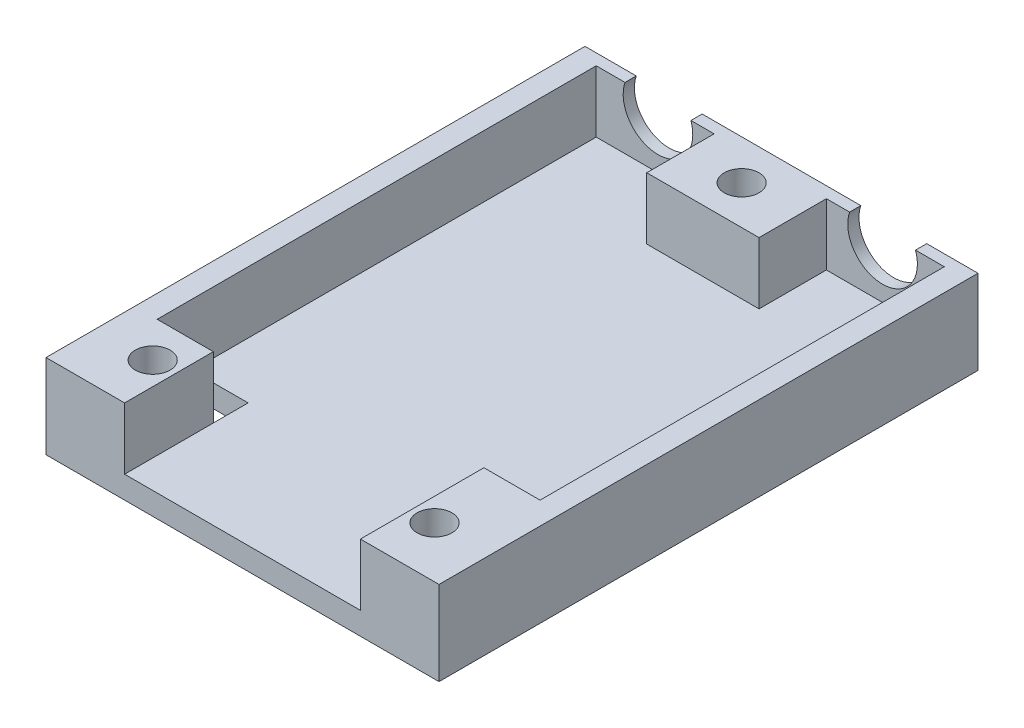
ISO-10303-21;
HEADER;
FILE_DESCRIPTION(('STEP AP214'),'2;1');
FILE_NAME('part.step','',(''),(''),'','','');
FILE_SCHEMA(('AUTOMOTIVE_DESIGN { 1 0 10303 214 1 1 1 1 }'));
ENDSEC;
DATA;
#1=APPLICATION_CONTEXT('core data for automotive mechanical design processes');
#2=APPLICATION_PROTOCOL_DEFINITION('international standard','automotive_design',2000,#1);
#3=PRODUCT_CONTEXT('',#1,'mechanical');
#4=PRODUCT('Part','Part','',(#3));
#5=PRODUCT_RELATED_PRODUCT_CATEGORY('part','',(#4));
#6=PRODUCT_DEFINITION_FORMATION('','',#4);
#7=PRODUCT_DEFINITION_CONTEXT('part definition',#1,'design');
#8=PRODUCT_DEFINITION('design','',#6,#7);
#9=PRODUCT_DEFINITION_SHAPE('','',#8);
#10=(LENGTH_UNIT() NAMED_UNIT(*) SI_UNIT(.MILLI.,.METRE.));
#11=(NAMED_UNIT(*) PLANE_ANGLE_UNIT() SI_UNIT($,.RADIAN.));
#12=(NAMED_UNIT(*) SI_UNIT($,.STERADIAN.) SOLID_ANGLE_UNIT());
#13=UNCERTAINTY_MEASURE_WITH_UNIT(LENGTH_MEASURE(1.E-05),#10,'distance_accuracy_value','');
#14=(GEOMETRIC_REPRESENTATION_CONTEXT(3) GLOBAL_UNCERTAINTY_ASSIGNED_CONTEXT((#13)) GLOBAL_UNIT_ASSIGNED_CONTEXT((#10,
#11,#12)) REPRESENTATION_CONTEXT('',''));
#15=CARTESIAN_POINT('',(0.,0.,0.));
#16=DIRECTION('',(0.,0.,1.));
#17=DIRECTION('',(1.,0.,0.));
#18=AXIS2_PLACEMENT_3D('',#15,#16,#17);
#19=CARTESIAN_POINT('',(0.,7.5,-23.));
#20=DIRECTION('',(0.,0.,-1.));
#21=DIRECTION('',(-1.,0.,0.));
#22=AXIS2_PLACEMENT_3D('',#19,#20,#21);
#23=PLANE('',#22);
#24=CARTESIAN_POINT('',(-10.,6.5,-23.));
#25=DIRECTION('',(0.,0.,-1.));
#26=DIRECTION('',(-1.,0.,0.));
#27=AXIS2_PLACEMENT_3D('',#24,#25,#26);
#28=CIRCLE('',#27,3.1);
#29=CARTESIAN_POINT('',(-12.9342801502242,7.5,-23.));
#30=VERTEX_POINT('',#29);
#31=CARTESIAN_POINT('',(-7.06571984977576,7.5,-23.));
#32=VERTEX_POINT('',#31);
#33=EDGE_CURVE('E299',#30,#32,#28,.F.);
#34=ORIENTED_EDGE('',*,*,#33,.F.);
#35=DIRECTION('',(1.,0.,0.));
#36=VECTOR('',#35,1.);
#37=CARTESIAN_POINT('',(0.,7.5,-23.));
#38=LINE('',#37,#36);
#39=CARTESIAN_POINT('',(-15.5,7.5,-23.));
#40=VERTEX_POINT('',#39);
#41=EDGE_CURVE('E494',#40,#30,#38,.T.);
#42=ORIENTED_EDGE('',*,*,#41,.F.);
#43=DIRECTION('',(0.,-1.,0.));
#44=VECTOR('',#43,1.);
#45=CARTESIAN_POINT('',(-15.5,7.5,-23.));
#46=LINE('',#45,#44);
#47=CARTESIAN_POINT('',(-15.5,2.,-23.));
#48=VERTEX_POINT('',#47);
#49=EDGE_CURVE('E249',#40,#48,#46,.T.);
#50=ORIENTED_EDGE('',*,*,#49,.T.);
#51=DIRECTION('',(1.,0.,0.));
#52=VECTOR('',#51,1.);
#53=CARTESIAN_POINT('',(0.,2.,-23.));
#54=LINE('',#53,#52);
#55=CARTESIAN_POINT('',(-4.99999999999998,2.,-23.));
#56=VERTEX_POINT('',#55);
#57=EDGE_CURVE('E502',#48,#56,#54,.T.);
#58=ORIENTED_EDGE('',*,*,#57,.T.);
#59=DIRECTION('',(0.,-1.,0.));
#60=VECTOR('',#59,1.);
#61=CARTESIAN_POINT('',(-4.99999999999998,7.5,-23.));
#62=LINE('',#61,#60);
#63=CARTESIAN_POINT('',(-4.99999999999998,7.5,-23.));
#64=VERTEX_POINT('',#63);
#65=EDGE_CURVE('E452',#64,#56,#62,.T.);
#66=ORIENTED_EDGE('',*,*,#65,.F.);
#67=EDGE_CURVE('E497',#32,#64,#38,.T.);
#68=ORIENTED_EDGE('',*,*,#67,.F.);
#69=EDGE_LOOP('',(#34,#42,#50,#58,#66,#68));
#70=FACE_BOUND('',#69,.T.);
#71=ADVANCED_FACE('F41',(#70),#23,.F.);
#72=CARTESIAN_POINT('',(10.,6.5,-23.));
#73=DIRECTION('',(0.,0.,-1.));
#74=DIRECTION('',(-1.,0.,0.));
#75=AXIS2_PLACEMENT_3D('',#72,#73,#74);
#76=CIRCLE('',#75,3.1);
#77=CARTESIAN_POINT('',(7.06571984977576,7.5,-23.));
#78=VERTEX_POINT('',#77);
#79=CARTESIAN_POINT('',(12.9342801502242,7.5,-23.));
#80=VERTEX_POINT('',#79);
#81=EDGE_CURVE('E304',#78,#80,#76,.F.);
#82=ORIENTED_EDGE('',*,*,#81,.F.);
#83=CARTESIAN_POINT('',(5.00000000000002,7.5,-23.));
#84=VERTEX_POINT('',#83);
#85=EDGE_CURVE('E498',#84,#78,#38,.T.);
#86=ORIENTED_EDGE('',*,*,#85,.F.);
#87=DIRECTION('',(0.,-1.,0.));
#88=VECTOR('',#87,1.);
#89=CARTESIAN_POINT('',(5.00000000000002,7.5,-23.));
#90=LINE('',#89,#88);
#91=CARTESIAN_POINT('',(5.00000000000002,2.,-23.));
#92=VERTEX_POINT('',#91);
#93=EDGE_CURVE('E464',#84,#92,#90,.T.);
#94=ORIENTED_EDGE('',*,*,#93,.T.);
#95=CARTESIAN_POINT('',(15.5,2.,-23.));
#96=VERTEX_POINT('',#95);
#97=EDGE_CURVE('E474',#92,#96,#54,.T.);
#98=ORIENTED_EDGE('',*,*,#97,.T.);
#99=DIRECTION('',(0.,-1.,0.));
#100=VECTOR('',#99,1.);
#101=CARTESIAN_POINT('',(15.5,7.5,-23.));
#102=LINE('',#101,#100);
#103=CARTESIAN_POINT('',(15.5,7.5,-23.));
#104=VERTEX_POINT('',#103);
#105=EDGE_CURVE('E516',#104,#96,#102,.T.);
#106=ORIENTED_EDGE('',*,*,#105,.F.);
#107=EDGE_CURVE('E493',#80,#104,#38,.T.);
#108=ORIENTED_EDGE('',*,*,#107,.F.);
#109=EDGE_LOOP('',(#82,#86,#94,#98,#106,#108));
#110=FACE_BOUND('',#109,.T.);
#111=ADVANCED_FACE('F597',(#110),#23,.F.);
#112=CARTESIAN_POINT('',(-17.5,2.,-24.));
#113=DIRECTION('',(0.,0.,1.));
#114=DIRECTION('',(1.,0.,0.));
#115=AXIS2_PLACEMENT_3D('',#112,#113,#114);
#116=PLANE('',#115);
#117=CARTESIAN_POINT('',(10.,6.5,-24.));
#118=DIRECTION('',(0.,0.,-1.));
#119=DIRECTION('',(-1.,0.,0.));
#120=AXIS2_PLACEMENT_3D('',#117,#118,#119);
#121=CIRCLE('',#120,3.1);
#122=CARTESIAN_POINT('',(7.06571984977576,7.5,-24.));
#123=VERTEX_POINT('',#122);
#124=CARTESIAN_POINT('',(12.9342801502242,7.5,-24.));
#125=VERTEX_POINT('',#124);
#126=EDGE_CURVE('E295',#123,#125,#121,.F.);
#127=ORIENTED_EDGE('',*,*,#126,.T.);
#128=DIRECTION('',(-1.,0.,0.));
#129=VECTOR('',#128,1.);
#130=CARTESIAN_POINT('',(0.,7.5,-24.));
#131=LINE('',#130,#129);
#132=CARTESIAN_POINT('',(17.5,7.5,-24.));
#133=VERTEX_POINT('',#132);
#134=EDGE_CURVE('E475',#133,#125,#131,.T.);
#135=ORIENTED_EDGE('',*,*,#134,.F.);
#136=DIRECTION('',(0.,-1.,0.));
#137=VECTOR('',#136,1.);
#138=CARTESIAN_POINT('',(17.5,2.,-24.));
#139=LINE('',#138,#137);
#140=CARTESIAN_POINT('',(17.5,0.,-24.));
#141=VERTEX_POINT('',#140);
#142=EDGE_CURVE('E537',#133,#141,#139,.T.);
#143=ORIENTED_EDGE('',*,*,#142,.T.);
#144=DIRECTION('',(-1.,0.,0.));
#145=VECTOR('',#144,1.);
#146=CARTESIAN_POINT('',(-17.5,0.,-24.));
#147=LINE('',#146,#145);
#148=CARTESIAN_POINT('',(-17.5,0.,-24.));
#149=VERTEX_POINT('',#148);
#150=EDGE_CURVE('E530',#141,#149,#147,.T.);
#151=ORIENTED_EDGE('',*,*,#150,.T.);
#152=DIRECTION('',(0.,-1.,0.));
#153=VECTOR('',#152,1.);
#154=CARTESIAN_POINT('',(-17.5,2.,-24.));
#155=LINE('',#154,#153);
#156=CARTESIAN_POINT('',(-17.5,7.5,-24.));
#157=VERTEX_POINT('',#156);
#158=EDGE_CURVE('E533',#157,#149,#155,.T.);
#159=ORIENTED_EDGE('',*,*,#158,.F.);
#160=CARTESIAN_POINT('',(-12.9342801502242,7.5,-24.));
#161=VERTEX_POINT('',#160);
#162=EDGE_CURVE('E481',#161,#157,#131,.T.);
#163=ORIENTED_EDGE('',*,*,#162,.F.);
#164=CARTESIAN_POINT('',(-10.,6.5,-24.));
#165=DIRECTION('',(0.,0.,-1.));
#166=DIRECTION('',(-1.,0.,0.));
#167=AXIS2_PLACEMENT_3D('',#164,#165,#166);
#168=CIRCLE('',#167,3.1);
#169=CARTESIAN_POINT('',(-7.06571984977576,7.5,-24.));
#170=VERTEX_POINT('',#169);
#171=EDGE_CURVE('E65',#161,#170,#168,.F.);
#172=ORIENTED_EDGE('',*,*,#171,.T.);
#173=EDGE_CURVE('E480',#123,#170,#131,.T.);
#174=ORIENTED_EDGE('',*,*,#173,.F.);
#175=EDGE_LOOP('',(#127,#135,#143,#151,#159,#163,#172,#174));
#176=FACE_BOUND('',#175,.T.);
#177=ADVANCED_FACE('F566',(#176),#116,.F.);
#178=CARTESIAN_POINT('',(0.,7.5,0.));
#179=DIRECTION('',(0.,1.,0.));
#180=DIRECTION('',(0.,0.,1.));
#181=AXIS2_PLACEMENT_3D('',#178,#179,#180);
#182=PLANE('',#181);
#183=CARTESIAN_POINT('',(12.55,7.5,19.45));
#184=DIRECTION('',(0.,1.,0.));
#185=DIRECTION('',(0.,0.,1.));
#186=AXIS2_PLACEMENT_3D('',#183,#184,#185);
#187=CIRCLE('',#186,1.55);
#188=CARTESIAN_POINT('',(12.55,7.5,21.));
#189=VERTEX_POINT('',#188);
#190=EDGE_CURVE('E946',#189,#189,#187,.T.);
#191=ORIENTED_EDGE('',*,*,#190,.F.);
#192=EDGE_LOOP('',(#191));
#193=FACE_BOUND('',#192,.T.);
#194=ORIENTED_EDGE('',*,*,#134,.T.);
#195=DIRECTION('',(0.,0.,-1.));
#196=VECTOR('',#195,1.);
#197=CARTESIAN_POINT('',(12.9342801502242,7.5,-22.));
#198=LINE('',#197,#196);
#199=EDGE_CURVE('E11',#125,#80,#198,.F.);
#200=ORIENTED_EDGE('',*,*,#199,.T.);
#201=ORIENTED_EDGE('',*,*,#107,.T.);
#202=DIRECTION('',(0.,0.,1.));
#203=VECTOR('',#202,1.);
#204=CARTESIAN_POINT('',(15.5,7.5,0.));
#205=LINE('',#204,#203);
#206=CARTESIAN_POINT('',(15.5,7.5,13.));
#207=VERTEX_POINT('',#206);
#208=EDGE_CURVE('E255',#104,#207,#205,.T.);
#209=ORIENTED_EDGE('',*,*,#208,.T.);
#210=DIRECTION('',(-1.,0.,0.));
#211=VECTOR('',#210,1.);
#212=CARTESIAN_POINT('',(15.5,7.5,13.));
#213=LINE('',#212,#211);
#214=CARTESIAN_POINT('',(10.5,7.5,13.));
#215=VERTEX_POINT('',#214);
#216=EDGE_CURVE('E410',#207,#215,#213,.T.);
#217=ORIENTED_EDGE('',*,*,#216,.T.);
#218=DIRECTION('',(0.,0.,1.));
#219=VECTOR('',#218,1.);
#220=CARTESIAN_POINT('',(10.5,7.5,21.));
#221=LINE('',#220,#219);
#222=CARTESIAN_POINT('',(10.5,7.5,24.));
#223=VERTEX_POINT('',#222);
#224=EDGE_CURVE('E413',#215,#223,#221,.T.);
#225=ORIENTED_EDGE('',*,*,#224,.T.);
#226=DIRECTION('',(1.,0.,0.));
#227=VECTOR('',#226,1.);
#228=CARTESIAN_POINT('',(0.,7.5,24.));
#229=LINE('',#228,#227);
#230=CARTESIAN_POINT('',(17.5,7.5,24.));
#231=VERTEX_POINT('',#230);
#232=EDGE_CURVE('E485',#223,#231,#229,.T.);
#233=ORIENTED_EDGE('',*,*,#232,.T.);
#234=DIRECTION('',(0.,0.,-1.));
#235=VECTOR('',#234,1.);
#236=CARTESIAN_POINT('',(17.5,7.5,0.));
#237=LINE('',#236,#235);
#238=EDGE_CURVE('E489',#231,#133,#237,.T.);
#239=ORIENTED_EDGE('',*,*,#238,.T.);
#240=EDGE_LOOP('',(#194,#200,#201,#209,#217,#225,#233,#239));
#241=FACE_BOUND('',#240,.T.);
#242=ADVANCED_FACE('F608',(#193,#241),#182,.T.);
#243=CARTESIAN_POINT('',(0.,7.5,-20.45));
#244=DIRECTION('',(0.,1.,0.));
#245=DIRECTION('',(0.,0.,1.));
#246=AXIS2_PLACEMENT_3D('',#243,#244,#245);
#247=CIRCLE('',#246,1.55);
#248=CARTESIAN_POINT('',(0.,7.5,-18.9));
#249=VERTEX_POINT('',#248);
#250=EDGE_CURVE('E959',#249,#249,#247,.T.);
#251=ORIENTED_EDGE('',*,*,#250,.F.);
#252=EDGE_LOOP('',(#251));
#253=FACE_BOUND('',#252,.T.);
#254=ORIENTED_EDGE('',*,*,#85,.T.);
#255=DIRECTION('',(0.,0.,-1.));
#256=VECTOR('',#255,1.);
#257=CARTESIAN_POINT('',(7.06571984977576,7.5,-22.));
#258=LINE('',#257,#256);
#259=EDGE_CURVE('E50',#78,#123,#258,.T.);
#260=ORIENTED_EDGE('',*,*,#259,.T.);
#261=ORIENTED_EDGE('',*,*,#173,.T.);
#262=DIRECTION('',(0.,0.,-1.));
#263=VECTOR('',#262,1.);
#264=CARTESIAN_POINT('',(-7.06571984977576,7.5,-22.));
#265=LINE('',#264,#263);
#266=EDGE_CURVE('E552',#170,#32,#265,.F.);
#267=ORIENTED_EDGE('',*,*,#266,.T.);
#268=ORIENTED_EDGE('',*,*,#67,.T.);
#269=DIRECTION('',(0.,0.,1.));
#270=VECTOR('',#269,1.);
#271=CARTESIAN_POINT('',(-4.99999999999998,7.5,-23.));
#272=LINE('',#271,#270);
#273=CARTESIAN_POINT('',(-4.99999999999998,7.5,-17.));
#274=VERTEX_POINT('',#273);
#275=EDGE_CURVE('E441',#64,#274,#272,.T.);
#276=ORIENTED_EDGE('',*,*,#275,.T.);
#277=DIRECTION('',(1.,0.,0.));
#278=VECTOR('',#277,1.);
#279=CARTESIAN_POINT('',(-4.99999999999998,7.5,-17.));
#280=LINE('',#279,#278);
#281=CARTESIAN_POINT('',(5.00000000000002,7.5,-17.));
#282=VERTEX_POINT('',#281);
#283=EDGE_CURVE('E445',#274,#282,#280,.T.);
#284=ORIENTED_EDGE('',*,*,#283,.T.);
#285=DIRECTION('',(0.,0.,-1.));
#286=VECTOR('',#285,1.);
#287=CARTESIAN_POINT('',(5.00000000000002,7.5,-23.));
#288=LINE('',#287,#286);
#289=EDGE_CURVE('E449',#282,#84,#288,.T.);
#290=ORIENTED_EDGE('',*,*,#289,.T.);
#291=EDGE_LOOP('',(#254,#260,#261,#267,#268,#276,#284,#290));
#292=FACE_BOUND('',#291,.T.);
#293=ADVANCED_FACE('F561',(#253,#292),#182,.T.);
#294=CARTESIAN_POINT('',(-12.55,7.5,19.45));
#295=DIRECTION('',(0.,1.,0.));
#296=DIRECTION('',(0.,0.,1.));
#297=AXIS2_PLACEMENT_3D('',#294,#295,#296);
#298=CIRCLE('',#297,1.55);
#299=CARTESIAN_POINT('',(-12.55,7.5,21.));
#300=VERTEX_POINT('',#299);
#301=EDGE_CURVE('E274',#300,#300,#298,.T.);
#302=ORIENTED_EDGE('',*,*,#301,.F.);
#303=EDGE_LOOP('',(#302));
#304=FACE_BOUND('',#303,.T.);
#305=DIRECTION('',(1.,0.,0.));
#306=VECTOR('',#305,1.);
#307=CARTESIAN_POINT('',(-15.5,7.5,16.1));
#308=LINE('',#307,#306);
#309=CARTESIAN_POINT('',(-15.5,7.5,16.1));
#310=VERTEX_POINT('',#309);
#311=CARTESIAN_POINT('',(-10.5,7.5,16.1));
#312=VERTEX_POINT('',#311);
#313=EDGE_CURVE('E258',#310,#312,#308,.T.);
#314=ORIENTED_EDGE('',*,*,#313,.F.);
#315=DIRECTION('',(0.,0.,1.));
#316=VECTOR('',#315,1.);
#317=CARTESIAN_POINT('',(-15.5,7.5,0.));
#318=LINE('',#317,#316);
#319=EDGE_CURVE('E242',#40,#310,#318,.T.);
#320=ORIENTED_EDGE('',*,*,#319,.F.);
#321=ORIENTED_EDGE('',*,*,#41,.T.);
#322=DIRECTION('',(0.,0.,-1.));
#323=VECTOR('',#322,1.);
#324=CARTESIAN_POINT('',(-12.9342801502242,7.5,-22.));
#325=LINE('',#324,#323);
#326=EDGE_CURVE('E549',#30,#161,#325,.T.);
#327=ORIENTED_EDGE('',*,*,#326,.T.);
#328=ORIENTED_EDGE('',*,*,#162,.T.);
#329=DIRECTION('',(0.,0.,1.));
#330=VECTOR('',#329,1.);
#331=CARTESIAN_POINT('',(-17.5,7.5,0.));
#332=LINE('',#331,#330);
#333=CARTESIAN_POINT('',(-17.5,7.5,24.));
#334=VERTEX_POINT('',#333);
#335=EDGE_CURVE('E479',#157,#334,#332,.T.);
#336=ORIENTED_EDGE('',*,*,#335,.T.);
#337=CARTESIAN_POINT('',(-10.5,7.5,24.));
#338=VERTEX_POINT('',#337);
#339=EDGE_CURVE('E486',#334,#338,#229,.T.);
#340=ORIENTED_EDGE('',*,*,#339,.T.);
#341=DIRECTION('',(0.,0.,-1.));
#342=VECTOR('',#341,1.);
#343=CARTESIAN_POINT('',(-10.5,7.5,21.));
#344=LINE('',#343,#342);
#345=EDGE_CURVE('E268',#338,#312,#344,.T.);
#346=ORIENTED_EDGE('',*,*,#345,.T.);
#347=EDGE_LOOP('',(#314,#320,#321,#327,#328,#336,#340,#346));
#348=FACE_BOUND('',#347,.T.);
#349=ADVANCED_FACE('F266',(#304,#348),#182,.T.);
#350=CARTESIAN_POINT('',(0.,0.,0.));
#351=DIRECTION('',(0.,1.,0.));
#352=DIRECTION('',(0.,0.,1.));
#353=AXIS2_PLACEMENT_3D('',#350,#351,#352);
#354=PLANE('',#353);
#355=DIRECTION('',(1.,0.,0.));
#356=VECTOR('',#355,1.);
#357=CARTESIAN_POINT('',(-15.5,0.,13.));
#358=LINE('',#357,#356);
#359=CARTESIAN_POINT('',(-15.5,0.,13.));
#360=VERTEX_POINT('',#359);
#361=CARTESIAN_POINT('',(-10.5,0.,13.));
#362=VERTEX_POINT('',#361);
#363=EDGE_CURVE('E589',#360,#362,#358,.T.);
#364=ORIENTED_EDGE('',*,*,#363,.F.);
#365=DIRECTION('',(0.,0.,-1.));
#366=VECTOR('',#365,1.);
#367=CARTESIAN_POINT('',(-15.5,0.,13.));
#368=LINE('',#367,#366);
#369=CARTESIAN_POINT('',(-15.5,0.,16.1));
#370=VERTEX_POINT('',#369);
#371=EDGE_CURVE('E278',#370,#360,#368,.T.);
#372=ORIENTED_EDGE('',*,*,#371,.F.);
#373=DIRECTION('',(-1.,0.,0.));
#374=VECTOR('',#373,1.);
#375=CARTESIAN_POINT('',(-15.5,0.,16.1));
#376=LINE('',#375,#374);
#377=CARTESIAN_POINT('',(-10.5,0.,16.1));
#378=VERTEX_POINT('',#377);
#379=EDGE_CURVE('E261',#378,#370,#376,.T.);
#380=ORIENTED_EDGE('',*,*,#379,.F.);
#381=DIRECTION('',(0.,0.,1.));
#382=VECTOR('',#381,1.);
#383=CARTESIAN_POINT('',(-10.5,0.,13.));
#384=LINE('',#383,#382);
#385=EDGE_CURVE('E283',#362,#378,#384,.T.);
#386=ORIENTED_EDGE('',*,*,#385,.F.);
#387=EDGE_LOOP('',(#364,#372,#380,#386));
#388=FACE_BOUND('',#387,.T.);
#389=DIRECTION('',(0.,0.,-1.));
#390=VECTOR('',#389,1.);
#391=CARTESIAN_POINT('',(-2.44999999999999,0.,8.5));
#392=LINE('',#391,#390);
#393=CARTESIAN_POINT('',(-2.44999999999999,0.,8.5));
#394=VERTEX_POINT('',#393);
#395=CARTESIAN_POINT('',(-2.44999999999999,0.,3.6));
#396=VERTEX_POINT('',#395);
#397=EDGE_CURVE('E352',#394,#396,#392,.T.);
#398=ORIENTED_EDGE('',*,*,#397,.F.);
#399=DIRECTION('',(-1.,0.,0.));
#400=VECTOR('',#399,1.);
#401=CARTESIAN_POINT('',(-2.44999999999999,0.,8.5));
#402=LINE('',#401,#400);
#403=CARTESIAN_POINT('',(2.45000000000001,0.,8.5));
#404=VERTEX_POINT('',#403);
#405=EDGE_CURVE('E358',#404,#394,#402,.T.);
#406=ORIENTED_EDGE('',*,*,#405,.F.);
#407=DIRECTION('',(0.,0.,1.));
#408=VECTOR('',#407,1.);
#409=CARTESIAN_POINT('',(2.45000000000001,0.,8.5));
#410=LINE('',#409,#408);
#411=CARTESIAN_POINT('',(2.45000000000001,0.,3.6));
#412=VERTEX_POINT('',#411);
#413=EDGE_CURVE('E375',#412,#404,#410,.T.);
#414=ORIENTED_EDGE('',*,*,#413,.F.);
#415=DIRECTION('',(1.,0.,0.));
#416=VECTOR('',#415,1.);
#417=CARTESIAN_POINT('',(-2.44999999999999,0.,3.6));
#418=LINE('',#417,#416);
#419=EDGE_CURVE('E371',#396,#412,#418,.T.);
#420=ORIENTED_EDGE('',*,*,#419,.F.);
#421=EDGE_LOOP('',(#398,#406,#414,#420));
#422=FACE_BOUND('',#421,.T.);
#423=DIRECTION('',(0.,0.,1.));
#424=VECTOR('',#423,1.);
#425=CARTESIAN_POINT('',(-17.5,0.,-24.));
#426=LINE('',#425,#424);
#427=CARTESIAN_POINT('',(-17.5,0.,24.));
#428=VERTEX_POINT('',#427);
#429=EDGE_CURVE('E520',#149,#428,#426,.T.);
#430=ORIENTED_EDGE('',*,*,#429,.F.);
#431=ORIENTED_EDGE('',*,*,#150,.F.);
#432=DIRECTION('',(0.,0.,-1.));
#433=VECTOR('',#432,1.);
#434=CARTESIAN_POINT('',(17.5,0.,-24.));
#435=LINE('',#434,#433);
#436=CARTESIAN_POINT('',(17.5,0.,24.));
#437=VERTEX_POINT('',#436);
#438=EDGE_CURVE('E527',#437,#141,#435,.T.);
#439=ORIENTED_EDGE('',*,*,#438,.F.);
#440=DIRECTION('',(1.,0.,0.));
#441=VECTOR('',#440,1.);
#442=CARTESIAN_POINT('',(-17.5,0.,24.));
#443=LINE('',#442,#441);
#444=EDGE_CURVE('E524',#428,#437,#443,.T.);
#445=ORIENTED_EDGE('',*,*,#444,.F.);
#446=EDGE_LOOP('',(#430,#431,#439,#445));
#447=FACE_BOUND('',#446,.T.);
#448=DIRECTION('',(0.,0.,-1.));
#449=VECTOR('',#448,1.);
#450=CARTESIAN_POINT('',(-2.44999999999999,0.,-3.6));
#451=LINE('',#450,#449);
#452=CARTESIAN_POINT('',(-2.44999999999999,0.,-3.6));
#453=VERTEX_POINT('',#452);
#454=CARTESIAN_POINT('',(-2.44999999999999,0.,-8.5));
#455=VERTEX_POINT('',#454);
#456=EDGE_CURVE('E307',#453,#455,#451,.T.);
#457=ORIENTED_EDGE('',*,*,#456,.F.);
#458=DIRECTION('',(-1.,0.,0.));
#459=VECTOR('',#458,1.);
#460=CARTESIAN_POINT('',(-2.44999999999999,0.,-3.6));
#461=LINE('',#460,#459);
#462=CARTESIAN_POINT('',(2.45000000000001,0.,-3.6));
#463=VERTEX_POINT('',#462);
#464=EDGE_CURVE('E313',#463,#453,#461,.T.);
#465=ORIENTED_EDGE('',*,*,#464,.F.);
#466=DIRECTION('',(0.,0.,1.));
#467=VECTOR('',#466,1.);
#468=CARTESIAN_POINT('',(2.45000000000001,0.,-3.6));
#469=LINE('',#468,#467);
#470=CARTESIAN_POINT('',(2.45000000000001,0.,-8.5));
#471=VERTEX_POINT('',#470);
#472=EDGE_CURVE('E330',#471,#463,#469,.T.);
#473=ORIENTED_EDGE('',*,*,#472,.F.);
#474=DIRECTION('',(1.,0.,0.));
#475=VECTOR('',#474,1.);
#476=CARTESIAN_POINT('',(-2.44999999999999,0.,-8.5));
#477=LINE('',#476,#475);
#478=EDGE_CURVE('E326',#455,#471,#477,.T.);
#479=ORIENTED_EDGE('',*,*,#478,.F.);
#480=EDGE_LOOP('',(#457,#465,#473,#479));
#481=FACE_BOUND('',#480,.T.);
#482=ADVANCED_FACE('F621',(#388,#422,#447,#481),#354,.F.);
#483=CARTESIAN_POINT('',(0.,2.,0.));
#484=DIRECTION('',(0.,1.,0.));
#485=DIRECTION('',(0.,0.,1.));
#486=AXIS2_PLACEMENT_3D('',#483,#484,#485);
#487=PLANE('',#486);
#488=DIRECTION('',(0.,0.,1.));
#489=VECTOR('',#488,1.);
#490=CARTESIAN_POINT('',(10.5,2.,21.));
#491=LINE('',#490,#489);
#492=CARTESIAN_POINT('',(10.5,2.,13.));
#493=VERTEX_POINT('',#492);
#494=CARTESIAN_POINT('',(10.5,2.,24.));
#495=VERTEX_POINT('',#494);
#496=EDGE_CURVE('E414',#493,#495,#491,.T.);
#497=ORIENTED_EDGE('',*,*,#496,.F.);
#498=DIRECTION('',(-1.,0.,0.));
#499=VECTOR('',#498,1.);
#500=CARTESIAN_POINT('',(15.5,2.,13.));
#501=LINE('',#500,#499);
#502=CARTESIAN_POINT('',(15.5,2.,13.));
#503=VERTEX_POINT('',#502);
#504=EDGE_CURVE('E402',#503,#493,#501,.T.);
#505=ORIENTED_EDGE('',*,*,#504,.F.);
#506=DIRECTION('',(0.,0.,1.));
#507=VECTOR('',#506,1.);
#508=CARTESIAN_POINT('',(15.5,2.,0.));
#509=LINE('',#508,#507);
#510=EDGE_CURVE('E506',#96,#503,#509,.T.);
#511=ORIENTED_EDGE('',*,*,#510,.F.);
#512=ORIENTED_EDGE('',*,*,#97,.F.);
#513=DIRECTION('',(0.,0.,-1.));
#514=VECTOR('',#513,1.);
#515=CARTESIAN_POINT('',(5.00000000000002,2.,-23.));
#516=LINE('',#515,#514);
#517=CARTESIAN_POINT('',(5.00000000000002,2.,-17.));
#518=VERTEX_POINT('',#517);
#519=EDGE_CURVE('E446',#518,#92,#516,.T.);
#520=ORIENTED_EDGE('',*,*,#519,.F.);
#521=DIRECTION('',(1.,0.,0.));
#522=VECTOR('',#521,1.);
#523=CARTESIAN_POINT('',(-4.99999999999998,2.,-17.));
#524=LINE('',#523,#522);
#525=CARTESIAN_POINT('',(-4.99999999999998,2.,-17.));
#526=VERTEX_POINT('',#525);
#527=EDGE_CURVE('E456',#526,#518,#524,.T.);
#528=ORIENTED_EDGE('',*,*,#527,.F.);
#529=DIRECTION('',(0.,0.,1.));
#530=VECTOR('',#529,1.);
#531=CARTESIAN_POINT('',(-4.99999999999998,2.,-23.));
#532=LINE('',#531,#530);
#533=EDGE_CURVE('E433',#56,#526,#532,.T.);
#534=ORIENTED_EDGE('',*,*,#533,.F.);
#535=ORIENTED_EDGE('',*,*,#57,.F.);
#536=DIRECTION('',(0.,0.,1.));
#537=VECTOR('',#536,1.);
#538=CARTESIAN_POINT('',(-15.5,2.,0.));
#539=LINE('',#538,#537);
#540=CARTESIAN_POINT('',(-15.5,2.,13.));
#541=VERTEX_POINT('',#540);
#542=EDGE_CURVE('E510',#48,#541,#539,.T.);
#543=ORIENTED_EDGE('',*,*,#542,.T.);
#544=DIRECTION('',(-1.,0.,0.));
#545=VECTOR('',#544,1.);
#546=CARTESIAN_POINT('',(-15.5,2.,13.));
#547=LINE('',#546,#545);
#548=CARTESIAN_POINT('',(-10.5,2.,13.));
#549=VERTEX_POINT('',#548);
#550=EDGE_CURVE('E434',#549,#541,#547,.T.);
#551=ORIENTED_EDGE('',*,*,#550,.F.);
#552=DIRECTION('',(0.,0.,-1.));
#553=VECTOR('',#552,1.);
#554=CARTESIAN_POINT('',(-10.5,2.,0.));
#555=LINE('',#554,#553);
#556=CARTESIAN_POINT('',(-10.5,2.,16.1));
#557=VERTEX_POINT('',#556);
#558=EDGE_CURVE('E292',#557,#549,#555,.T.);
#559=ORIENTED_EDGE('',*,*,#558,.F.);
#560=DIRECTION('',(0.,0.,-1.));
#561=VECTOR('',#560,1.);
#562=CARTESIAN_POINT('',(-10.5,2.,21.));
#563=LINE('',#562,#561);
#564=CARTESIAN_POINT('',(-10.5,2.,24.));
#565=VERTEX_POINT('',#564);
#566=EDGE_CURVE('E430',#565,#557,#563,.T.);
#567=ORIENTED_EDGE('',*,*,#566,.F.);
#568=DIRECTION('',(1.,0.,0.));
#569=VECTOR('',#568,1.);
#570=CARTESIAN_POINT('',(-10.5,2.,24.));
#571=LINE('',#570,#569);
#572=EDGE_CURVE('E403',#565,#495,#571,.T.);
#573=ORIENTED_EDGE('',*,*,#572,.T.);
#574=EDGE_LOOP('',(#497,#505,#511,#512,#520,#528,#534,#535,#543,#551,#559,#567,#573));
#575=FACE_BOUND('',#574,.T.);
#576=ADVANCED_FACE('F602',(#575),#487,.T.);
#577=CARTESIAN_POINT('',(15.5,7.5,0.));
#578=DIRECTION('',(1.,0.,0.));
#579=DIRECTION('',(0.,0.,-1.));
#580=AXIS2_PLACEMENT_3D('',#577,#578,#579);
#581=PLANE('',#580);
#582=DIRECTION('',(0.,-1.,0.));
#583=VECTOR('',#582,1.);
#584=CARTESIAN_POINT('',(15.5,7.5,13.));
#585=LINE('',#584,#583);
#586=EDGE_CURVE('E426',#207,#503,#585,.T.);
#587=ORIENTED_EDGE('',*,*,#586,.F.);
#588=ORIENTED_EDGE('',*,*,#208,.F.);
#589=ORIENTED_EDGE('',*,*,#105,.T.);
#590=ORIENTED_EDGE('',*,*,#510,.T.);
#591=EDGE_LOOP('',(#587,#588,#589,#590));
#592=FACE_BOUND('',#591,.T.);
#593=ADVANCED_FACE('F605',(#592),#581,.F.);
#594=CARTESIAN_POINT('',(-15.5,7.5,0.));
#595=DIRECTION('',(1.,0.,0.));
#596=DIRECTION('',(0.,0.,-1.));
#597=AXIS2_PLACEMENT_3D('',#594,#595,#596);
#598=PLANE('',#597);
#599=ORIENTED_EDGE('',*,*,#319,.T.);
#600=DIRECTION('',(0.,1.,0.));
#601=VECTOR('',#600,1.);
#602=CARTESIAN_POINT('',(-15.5,-5.88302643203309,16.1));
#603=LINE('',#602,#601);
#604=EDGE_CURVE('E245',#370,#310,#603,.T.);
#605=ORIENTED_EDGE('',*,*,#604,.F.);
#606=ORIENTED_EDGE('',*,*,#371,.T.);
#607=DIRECTION('',(0.,1.,0.));
#608=VECTOR('',#607,1.);
#609=CARTESIAN_POINT('',(-15.5,-5.88302643203309,13.));
#610=LINE('',#609,#608);
#611=EDGE_CURVE('E280',#360,#541,#610,.T.);
#612=ORIENTED_EDGE('',*,*,#611,.T.);
#613=ORIENTED_EDGE('',*,*,#542,.F.);
#614=ORIENTED_EDGE('',*,*,#49,.F.);
#615=EDGE_LOOP('',(#599,#605,#606,#612,#613,#614));
#616=FACE_BOUND('',#615,.T.);
#617=ADVANCED_FACE('F244',(#616),#598,.T.);
#618=CARTESIAN_POINT('',(-17.5,2.,-24.));
#619=DIRECTION('',(1.,0.,0.));
#620=DIRECTION('',(0.,0.,-1.));
#621=AXIS2_PLACEMENT_3D('',#618,#619,#620);
#622=PLANE('',#621);
#623=ORIENTED_EDGE('',*,*,#429,.T.);
#624=DIRECTION('',(0.,-1.,0.));
#625=VECTOR('',#624,1.);
#626=CARTESIAN_POINT('',(-17.5,2.,24.));
#627=LINE('',#626,#625);
#628=EDGE_CURVE('E545',#334,#428,#627,.T.);
#629=ORIENTED_EDGE('',*,*,#628,.F.);
#630=ORIENTED_EDGE('',*,*,#335,.F.);
#631=ORIENTED_EDGE('',*,*,#158,.T.);
#632=EDGE_LOOP('',(#623,#629,#630,#631));
#633=FACE_BOUND('',#632,.T.);
#634=ADVANCED_FACE('F43',(#633),#622,.F.);
#635=CARTESIAN_POINT('',(-17.5,2.,24.));
#636=DIRECTION('',(0.,0.,-1.));
#637=DIRECTION('',(-1.,0.,0.));
#638=AXIS2_PLACEMENT_3D('',#635,#636,#637);
#639=PLANE('',#638);
#640=ORIENTED_EDGE('',*,*,#232,.F.);
#641=DIRECTION('',(0.,1.,0.));
#642=VECTOR('',#641,1.);
#643=CARTESIAN_POINT('',(10.5,7.5,24.));
#644=LINE('',#643,#642);
#645=EDGE_CURVE('E398',#495,#223,#644,.T.);
#646=ORIENTED_EDGE('',*,*,#645,.F.);
#647=ORIENTED_EDGE('',*,*,#572,.F.);
#648=DIRECTION('',(0.,-1.,0.));
#649=VECTOR('',#648,1.);
#650=CARTESIAN_POINT('',(-10.5,7.5,24.));
#651=LINE('',#650,#649);
#652=EDGE_CURVE('E397',#338,#565,#651,.T.);
#653=ORIENTED_EDGE('',*,*,#652,.F.);
#654=ORIENTED_EDGE('',*,*,#339,.F.);
#655=ORIENTED_EDGE('',*,*,#628,.T.);
#656=ORIENTED_EDGE('',*,*,#444,.T.);
#657=DIRECTION('',(0.,-1.,0.));
#658=VECTOR('',#657,1.);
#659=CARTESIAN_POINT('',(17.5,2.,24.));
#660=LINE('',#659,#658);
#661=EDGE_CURVE('E541',#231,#437,#660,.T.);
#662=ORIENTED_EDGE('',*,*,#661,.F.);
#663=EDGE_LOOP('',(#640,#646,#647,#653,#654,#655,#656,#662));
#664=FACE_BOUND('',#663,.T.);
#665=ADVANCED_FACE('F579',(#664),#639,.F.);
#666=CARTESIAN_POINT('',(17.5,2.,-24.));
#667=DIRECTION('',(-1.,0.,0.));
#668=DIRECTION('',(0.,0.,1.));
#669=AXIS2_PLACEMENT_3D('',#666,#667,#668);
#670=PLANE('',#669);
#671=ORIENTED_EDGE('',*,*,#438,.T.);
#672=ORIENTED_EDGE('',*,*,#142,.F.);
#673=ORIENTED_EDGE('',*,*,#238,.F.);
#674=ORIENTED_EDGE('',*,*,#661,.T.);
#675=EDGE_LOOP('',(#671,#672,#673,#674));
#676=FACE_BOUND('',#675,.T.);
#677=ADVANCED_FACE('F619',(#676),#670,.F.);
#678=CARTESIAN_POINT('',(-4.99999999999998,7.5,-23.));
#679=DIRECTION('',(1.,0.,0.));
#680=DIRECTION('',(0.,0.,-1.));
#681=AXIS2_PLACEMENT_3D('',#678,#679,#680);
#682=PLANE('',#681);
#683=ORIENTED_EDGE('',*,*,#533,.T.);
#684=DIRECTION('',(0.,-1.,0.));
#685=VECTOR('',#684,1.);
#686=CARTESIAN_POINT('',(-4.99999999999998,7.5,-17.));
#687=LINE('',#686,#685);
#688=EDGE_CURVE('E471',#274,#526,#687,.T.);
#689=ORIENTED_EDGE('',*,*,#688,.F.);
#690=ORIENTED_EDGE('',*,*,#275,.F.);
#691=ORIENTED_EDGE('',*,*,#65,.T.);
#692=EDGE_LOOP('',(#683,#689,#690,#691));
#693=FACE_BOUND('',#692,.T.);
#694=ADVANCED_FACE('F667',(#693),#682,.F.);
#695=CARTESIAN_POINT('',(-4.99999999999998,7.5,-17.));
#696=DIRECTION('',(0.,0.,-1.));
#697=DIRECTION('',(-1.,0.,0.));
#698=AXIS2_PLACEMENT_3D('',#695,#696,#697);
#699=PLANE('',#698);
#700=ORIENTED_EDGE('',*,*,#527,.T.);
#701=DIRECTION('',(0.,-1.,0.));
#702=VECTOR('',#701,1.);
#703=CARTESIAN_POINT('',(5.00000000000002,7.5,-17.));
#704=LINE('',#703,#702);
#705=EDGE_CURVE('E468',#282,#518,#704,.T.);
#706=ORIENTED_EDGE('',*,*,#705,.F.);
#707=ORIENTED_EDGE('',*,*,#283,.F.);
#708=ORIENTED_EDGE('',*,*,#688,.T.);
#709=EDGE_LOOP('',(#700,#706,#707,#708));
#710=FACE_BOUND('',#709,.T.);
#711=ADVANCED_FACE('F684',(#710),#699,.F.);
#712=CARTESIAN_POINT('',(5.00000000000002,7.5,-23.));
#713=DIRECTION('',(-1.,0.,0.));
#714=DIRECTION('',(0.,0.,1.));
#715=AXIS2_PLACEMENT_3D('',#712,#713,#714);
#716=PLANE('',#715);
#717=ORIENTED_EDGE('',*,*,#519,.T.);
#718=ORIENTED_EDGE('',*,*,#93,.F.);
#719=ORIENTED_EDGE('',*,*,#289,.F.);
#720=ORIENTED_EDGE('',*,*,#705,.T.);
#721=EDGE_LOOP('',(#717,#718,#719,#720));
#722=FACE_BOUND('',#721,.T.);
#723=ADVANCED_FACE('F688',(#722),#716,.F.);
#724=CARTESIAN_POINT('',(-10.5,7.5,21.));
#725=DIRECTION('',(-1.,0.,0.));
#726=DIRECTION('',(0.,0.,1.));
#727=AXIS2_PLACEMENT_3D('',#724,#725,#726);
#728=PLANE('',#727);
#729=ORIENTED_EDGE('',*,*,#566,.T.);
#730=DIRECTION('',(0.,1.,0.));
#731=VECTOR('',#730,1.);
#732=CARTESIAN_POINT('',(-10.5,-5.88302643203309,16.1));
#733=LINE('',#732,#731);
#734=EDGE_CURVE('E263',#557,#312,#733,.T.);
#735=ORIENTED_EDGE('',*,*,#734,.T.);
#736=ORIENTED_EDGE('',*,*,#345,.F.);
#737=ORIENTED_EDGE('',*,*,#652,.T.);
#738=EDGE_LOOP('',(#729,#735,#736,#737));
#739=FACE_BOUND('',#738,.T.);
#740=ADVANCED_FACE('F585',(#739),#728,.F.);
#741=CARTESIAN_POINT('',(15.5,7.5,13.));
#742=DIRECTION('',(0.,0.,1.));
#743=DIRECTION('',(1.,0.,0.));
#744=AXIS2_PLACEMENT_3D('',#741,#742,#743);
#745=PLANE('',#744);
#746=ORIENTED_EDGE('',*,*,#504,.T.);
#747=DIRECTION('',(0.,-1.,0.));
#748=VECTOR('',#747,1.);
#749=CARTESIAN_POINT('',(10.5,7.5,13.));
#750=LINE('',#749,#748);
#751=EDGE_CURVE('E417',#215,#493,#750,.T.);
#752=ORIENTED_EDGE('',*,*,#751,.F.);
#753=ORIENTED_EDGE('',*,*,#216,.F.);
#754=ORIENTED_EDGE('',*,*,#586,.T.);
#755=EDGE_LOOP('',(#746,#752,#753,#754));
#756=FACE_BOUND('',#755,.T.);
#757=ADVANCED_FACE('F611',(#756),#745,.F.);
#758=CARTESIAN_POINT('',(10.5,7.5,21.));
#759=DIRECTION('',(1.,0.,0.));
#760=DIRECTION('',(0.,0.,-1.));
#761=AXIS2_PLACEMENT_3D('',#758,#759,#760);
#762=PLANE('',#761);
#763=ORIENTED_EDGE('',*,*,#496,.T.);
#764=ORIENTED_EDGE('',*,*,#645,.T.);
#765=ORIENTED_EDGE('',*,*,#224,.F.);
#766=ORIENTED_EDGE('',*,*,#751,.T.);
#767=EDGE_LOOP('',(#763,#764,#765,#766));
#768=FACE_BOUND('',#767,.T.);
#769=ADVANCED_FACE('F614',(#768),#762,.F.);
#770=CARTESIAN_POINT('',(-2.44999999999999,-2.,8.5));
#771=DIRECTION('',(1.,0.,0.));
#772=DIRECTION('',(0.,0.,-1.));
#773=AXIS2_PLACEMENT_3D('',#770,#771,#772);
#774=PLANE('',#773);
#775=ORIENTED_EDGE('',*,*,#397,.T.);
#776=DIRECTION('',(0.,1.,0.));
#777=VECTOR('',#776,1.);
#778=CARTESIAN_POINT('',(-2.44999999999999,-2.,3.6));
#779=LINE('',#778,#777);
#780=CARTESIAN_POINT('',(-2.44999999999999,-2.,3.6));
#781=VERTEX_POINT('',#780);
#782=EDGE_CURVE('E393',#781,#396,#779,.T.);
#783=ORIENTED_EDGE('',*,*,#782,.F.);
#784=DIRECTION('',(0.,0.,-1.));
#785=VECTOR('',#784,1.);
#786=CARTESIAN_POINT('',(-2.44999999999999,-2.,8.5));
#787=LINE('',#786,#785);
#788=CARTESIAN_POINT('',(-2.44999999999999,-2.,8.5));
#789=VERTEX_POINT('',#788);
#790=EDGE_CURVE('E353',#789,#781,#787,.T.);
#791=ORIENTED_EDGE('',*,*,#790,.F.);
#792=DIRECTION('',(0.,1.,0.));
#793=VECTOR('',#792,1.);
#794=CARTESIAN_POINT('',(-2.44999999999999,-2.,8.5));
#795=LINE('',#794,#793);
#796=EDGE_CURVE('E367',#789,#394,#795,.T.);
#797=ORIENTED_EDGE('',*,*,#796,.T.);
#798=EDGE_LOOP('',(#775,#783,#791,#797));
#799=FACE_BOUND('',#798,.T.);
#800=ADVANCED_FACE('F699',(#799),#774,.F.);
#801=CARTESIAN_POINT('',(-2.44999999999999,-2.,3.6));
#802=DIRECTION('',(0.,0.,1.));
#803=DIRECTION('',(1.,0.,0.));
#804=AXIS2_PLACEMENT_3D('',#801,#802,#803);
#805=PLANE('',#804);
#806=ORIENTED_EDGE('',*,*,#419,.T.);
#807=DIRECTION('',(0.,1.,0.));
#808=VECTOR('',#807,1.);
#809=CARTESIAN_POINT('',(2.45000000000001,-2.,3.6));
#810=LINE('',#809,#808);
#811=CARTESIAN_POINT('',(2.45000000000001,-2.,3.6));
#812=VERTEX_POINT('',#811);
#813=EDGE_CURVE('E389',#812,#412,#810,.T.);
#814=ORIENTED_EDGE('',*,*,#813,.F.);
#815=DIRECTION('',(1.,0.,0.));
#816=VECTOR('',#815,1.);
#817=CARTESIAN_POINT('',(-2.44999999999999,-2.,3.6));
#818=LINE('',#817,#816);
#819=EDGE_CURVE('E357',#781,#812,#818,.T.);
#820=ORIENTED_EDGE('',*,*,#819,.F.);
#821=ORIENTED_EDGE('',*,*,#782,.T.);
#822=EDGE_LOOP('',(#806,#814,#820,#821));
#823=FACE_BOUND('',#822,.T.);
#824=ADVANCED_FACE('F702',(#823),#805,.F.);
#825=CARTESIAN_POINT('',(2.45000000000001,-2.,8.5));
#826=DIRECTION('',(-1.,0.,0.));
#827=DIRECTION('',(0.,0.,1.));
#828=AXIS2_PLACEMENT_3D('',#825,#826,#827);
#829=PLANE('',#828);
#830=ORIENTED_EDGE('',*,*,#413,.T.);
#831=DIRECTION('',(0.,1.,0.));
#832=VECTOR('',#831,1.);
#833=CARTESIAN_POINT('',(2.45000000000001,-2.,8.5));
#834=LINE('',#833,#832);
#835=CARTESIAN_POINT('',(2.45000000000001,-2.,8.5));
#836=VERTEX_POINT('',#835);
#837=EDGE_CURVE('E385',#836,#404,#834,.T.);
#838=ORIENTED_EDGE('',*,*,#837,.F.);
#839=DIRECTION('',(0.,0.,1.));
#840=VECTOR('',#839,1.);
#841=CARTESIAN_POINT('',(2.45000000000001,-2.,8.5));
#842=LINE('',#841,#840);
#843=EDGE_CURVE('E361',#812,#836,#842,.T.);
#844=ORIENTED_EDGE('',*,*,#843,.F.);
#845=ORIENTED_EDGE('',*,*,#813,.T.);
#846=EDGE_LOOP('',(#830,#838,#844,#845));
#847=FACE_BOUND('',#846,.T.);
#848=ADVANCED_FACE('F706',(#847),#829,.F.);
#849=CARTESIAN_POINT('',(-2.44999999999999,-2.,8.5));
#850=DIRECTION('',(0.,0.,-1.));
#851=DIRECTION('',(-1.,0.,0.));
#852=AXIS2_PLACEMENT_3D('',#849,#850,#851);
#853=PLANE('',#852);
#854=ORIENTED_EDGE('',*,*,#405,.T.);
#855=ORIENTED_EDGE('',*,*,#796,.F.);
#856=DIRECTION('',(-1.,0.,0.));
#857=VECTOR('',#856,1.);
#858=CARTESIAN_POINT('',(-2.44999999999999,-2.,8.5));
#859=LINE('',#858,#857);
#860=EDGE_CURVE('E364',#836,#789,#859,.T.);
#861=ORIENTED_EDGE('',*,*,#860,.F.);
#862=ORIENTED_EDGE('',*,*,#837,.T.);
#863=EDGE_LOOP('',(#854,#855,#861,#862));
#864=FACE_BOUND('',#863,.T.);
#865=ADVANCED_FACE('F710',(#864),#853,.F.);
#866=CARTESIAN_POINT('',(0.,-2.,0.));
#867=DIRECTION('',(0.,-1.,0.));
#868=DIRECTION('',(0.,0.,-1.));
#869=AXIS2_PLACEMENT_3D('',#866,#867,#868);
#870=PLANE('',#869);
#871=ORIENTED_EDGE('',*,*,#790,.T.);
#872=ORIENTED_EDGE('',*,*,#819,.T.);
#873=ORIENTED_EDGE('',*,*,#843,.T.);
#874=ORIENTED_EDGE('',*,*,#860,.T.);
#875=EDGE_LOOP('',(#871,#872,#873,#874));
#876=FACE_BOUND('',#875,.T.);
#877=ADVANCED_FACE('F650',(#876),#870,.T.);
#878=CARTESIAN_POINT('',(-2.44999999999999,-2.,-3.6));
#879=DIRECTION('',(1.,0.,0.));
#880=DIRECTION('',(0.,0.,-1.));
#881=AXIS2_PLACEMENT_3D('',#878,#879,#880);
#882=PLANE('',#881);
#883=ORIENTED_EDGE('',*,*,#456,.T.);
#884=DIRECTION('',(0.,1.,0.));
#885=VECTOR('',#884,1.);
#886=CARTESIAN_POINT('',(-2.44999999999999,-2.,-8.5));
#887=LINE('',#886,#885);
#888=CARTESIAN_POINT('',(-2.44999999999999,-2.,-8.5));
#889=VERTEX_POINT('',#888);
#890=EDGE_CURVE('E348',#889,#455,#887,.T.);
#891=ORIENTED_EDGE('',*,*,#890,.F.);
#892=DIRECTION('',(0.,0.,-1.));
#893=VECTOR('',#892,1.);
#894=CARTESIAN_POINT('',(-2.44999999999999,-2.,-3.6));
#895=LINE('',#894,#893);
#896=CARTESIAN_POINT('',(-2.44999999999999,-2.,-3.6));
#897=VERTEX_POINT('',#896);
#898=EDGE_CURVE('E308',#897,#889,#895,.T.);
#899=ORIENTED_EDGE('',*,*,#898,.F.);
#900=DIRECTION('',(0.,1.,0.));
#901=VECTOR('',#900,1.);
#902=CARTESIAN_POINT('',(-2.44999999999999,-2.,-3.6));
#903=LINE('',#902,#901);
#904=EDGE_CURVE('E322',#897,#453,#903,.T.);
#905=ORIENTED_EDGE('',*,*,#904,.T.);
#906=EDGE_LOOP('',(#883,#891,#899,#905));
#907=FACE_BOUND('',#906,.T.);
#908=ADVANCED_FACE('F634',(#907),#882,.F.);
#909=CARTESIAN_POINT('',(-2.44999999999999,-2.,-8.5));
#910=DIRECTION('',(0.,0.,1.));
#911=DIRECTION('',(1.,0.,0.));
#912=AXIS2_PLACEMENT_3D('',#909,#910,#911);
#913=PLANE('',#912);
#914=ORIENTED_EDGE('',*,*,#478,.T.);
#915=DIRECTION('',(0.,1.,0.));
#916=VECTOR('',#915,1.);
#917=CARTESIAN_POINT('',(2.45000000000001,-2.,-8.5));
#918=LINE('',#917,#916);
#919=CARTESIAN_POINT('',(2.45000000000001,-2.,-8.5));
#920=VERTEX_POINT('',#919);
#921=EDGE_CURVE('E344',#920,#471,#918,.T.);
#922=ORIENTED_EDGE('',*,*,#921,.F.);
#923=DIRECTION('',(1.,0.,0.));
#924=VECTOR('',#923,1.);
#925=CARTESIAN_POINT('',(-2.44999999999999,-2.,-8.5));
#926=LINE('',#925,#924);
#927=EDGE_CURVE('E312',#889,#920,#926,.T.);
#928=ORIENTED_EDGE('',*,*,#927,.F.);
#929=ORIENTED_EDGE('',*,*,#890,.T.);
#930=EDGE_LOOP('',(#914,#922,#928,#929));
#931=FACE_BOUND('',#930,.T.);
#932=ADVANCED_FACE('F642',(#931),#913,.F.);
#933=CARTESIAN_POINT('',(2.45000000000001,-2.,-3.6));
#934=DIRECTION('',(-1.,0.,0.));
#935=DIRECTION('',(0.,0.,1.));
#936=AXIS2_PLACEMENT_3D('',#933,#934,#935);
#937=PLANE('',#936);
#938=ORIENTED_EDGE('',*,*,#472,.T.);
#939=DIRECTION('',(0.,1.,0.));
#940=VECTOR('',#939,1.);
#941=CARTESIAN_POINT('',(2.45000000000001,-2.,-3.6));
#942=LINE('',#941,#940);
#943=CARTESIAN_POINT('',(2.45000000000001,-2.,-3.6));
#944=VERTEX_POINT('',#943);
#945=EDGE_CURVE('E340',#944,#463,#942,.T.);
#946=ORIENTED_EDGE('',*,*,#945,.F.);
#947=DIRECTION('',(0.,0.,1.));
#948=VECTOR('',#947,1.);
#949=CARTESIAN_POINT('',(2.45000000000001,-2.,-3.6));
#950=LINE('',#949,#948);
#951=EDGE_CURVE('E316',#920,#944,#950,.T.);
#952=ORIENTED_EDGE('',*,*,#951,.F.);
#953=ORIENTED_EDGE('',*,*,#921,.T.);
#954=EDGE_LOOP('',(#938,#946,#952,#953));
#955=FACE_BOUND('',#954,.T.);
#956=ADVANCED_FACE('F640',(#955),#937,.F.);
#957=CARTESIAN_POINT('',(-2.44999999999999,-2.,-3.6));
#958=DIRECTION('',(0.,0.,-1.));
#959=DIRECTION('',(-1.,0.,0.));
#960=AXIS2_PLACEMENT_3D('',#957,#958,#959);
#961=PLANE('',#960);
#962=ORIENTED_EDGE('',*,*,#464,.T.);
#963=ORIENTED_EDGE('',*,*,#904,.F.);
#964=DIRECTION('',(-1.,0.,0.));
#965=VECTOR('',#964,1.);
#966=CARTESIAN_POINT('',(-2.44999999999999,-2.,-3.6));
#967=LINE('',#966,#965);
#968=EDGE_CURVE('E319',#944,#897,#967,.T.);
#969=ORIENTED_EDGE('',*,*,#968,.F.);
#970=ORIENTED_EDGE('',*,*,#945,.T.);
#971=EDGE_LOOP('',(#962,#963,#969,#970));
#972=FACE_BOUND('',#971,.T.);
#973=ADVANCED_FACE('F630',(#972),#961,.F.);
#974=CARTESIAN_POINT('',(0.,-2.,0.));
#975=DIRECTION('',(0.,-1.,0.));
#976=DIRECTION('',(0.,0.,-1.));
#977=AXIS2_PLACEMENT_3D('',#974,#975,#976);
#978=PLANE('',#977);
#979=ORIENTED_EDGE('',*,*,#898,.T.);
#980=ORIENTED_EDGE('',*,*,#927,.T.);
#981=ORIENTED_EDGE('',*,*,#951,.T.);
#982=ORIENTED_EDGE('',*,*,#968,.T.);
#983=EDGE_LOOP('',(#979,#980,#981,#982));
#984=FACE_BOUND('',#983,.T.);
#985=ADVANCED_FACE('F636',(#984),#978,.T.);
#986=CARTESIAN_POINT('',(-10.,6.5,-22.));
#987=DIRECTION('',(0.,0.,-1.));
#988=DIRECTION('',(-1.,0.,0.));
#989=AXIS2_PLACEMENT_3D('',#986,#987,#988);
#990=CYLINDRICAL_SURFACE('',#989,3.1);
#991=ORIENTED_EDGE('',*,*,#33,.T.);
#992=ORIENTED_EDGE('',*,*,#266,.F.);
#993=ORIENTED_EDGE('',*,*,#171,.F.);
#994=ORIENTED_EDGE('',*,*,#326,.F.);
#995=EDGE_LOOP('',(#991,#992,#993,#994));
#996=FACE_BOUND('',#995,.T.);
#997=ADVANCED_FACE('F759',(#996),#990,.F.);
#998=CARTESIAN_POINT('',(10.,6.5,-22.));
#999=DIRECTION('',(0.,0.,-1.));
#1000=DIRECTION('',(-1.,0.,0.));
#1001=AXIS2_PLACEMENT_3D('',#998,#999,#1000);
#1002=CYLINDRICAL_SURFACE('',#1001,3.1);
#1003=ORIENTED_EDGE('',*,*,#81,.T.);
#1004=ORIENTED_EDGE('',*,*,#199,.F.);
#1005=ORIENTED_EDGE('',*,*,#126,.F.);
#1006=ORIENTED_EDGE('',*,*,#259,.F.);
#1007=EDGE_LOOP('',(#1003,#1004,#1005,#1006));
#1008=FACE_BOUND('',#1007,.T.);
#1009=ADVANCED_FACE('F787',(#1008),#1002,.F.);
#1010=CARTESIAN_POINT('',(-15.5,-5.88302643203309,13.));
#1011=DIRECTION('',(0.,0.,-1.));
#1012=DIRECTION('',(-1.,0.,0.));
#1013=AXIS2_PLACEMENT_3D('',#1010,#1011,#1012);
#1014=PLANE('',#1013);
#1015=ORIENTED_EDGE('',*,*,#550,.T.);
#1016=ORIENTED_EDGE('',*,*,#611,.F.);
#1017=ORIENTED_EDGE('',*,*,#363,.T.);
#1018=DIRECTION('',(0.,1.,0.));
#1019=VECTOR('',#1018,1.);
#1020=CARTESIAN_POINT('',(-10.5,-5.88302643203309,13.));
#1021=LINE('',#1020,#1019);
#1022=EDGE_CURVE('E284',#362,#549,#1021,.T.);
#1023=ORIENTED_EDGE('',*,*,#1022,.T.);
#1024=EDGE_LOOP('',(#1015,#1016,#1017,#1023));
#1025=FACE_BOUND('',#1024,.T.);
#1026=ADVANCED_FACE('F796',(#1025),#1014,.F.);
#1027=CARTESIAN_POINT('',(-10.5,-5.88302643203309,13.));
#1028=DIRECTION('',(1.,0.,0.));
#1029=DIRECTION('',(0.,0.,-1.));
#1030=AXIS2_PLACEMENT_3D('',#1027,#1028,#1029);
#1031=PLANE('',#1030);
#1032=ORIENTED_EDGE('',*,*,#558,.T.);
#1033=ORIENTED_EDGE('',*,*,#1022,.F.);
#1034=ORIENTED_EDGE('',*,*,#385,.T.);
#1035=EDGE_CURVE('E57',#378,#557,#733,.T.);
#1036=ORIENTED_EDGE('',*,*,#1035,.T.);
#1037=EDGE_LOOP('',(#1032,#1033,#1034,#1036));
#1038=FACE_BOUND('',#1037,.T.);
#1039=ADVANCED_FACE('F834',(#1038),#1031,.F.);
#1040=CARTESIAN_POINT('',(-15.5,-5.88302643203309,16.1));
#1041=DIRECTION('',(0.,0.,1.));
#1042=DIRECTION('',(1.,0.,0.));
#1043=AXIS2_PLACEMENT_3D('',#1040,#1041,#1042);
#1044=PLANE('',#1043);
#1045=ORIENTED_EDGE('',*,*,#379,.T.);
#1046=ORIENTED_EDGE('',*,*,#604,.T.);
#1047=ORIENTED_EDGE('',*,*,#313,.T.);
#1048=ORIENTED_EDGE('',*,*,#734,.F.);
#1049=ORIENTED_EDGE('',*,*,#1035,.F.);
#1050=EDGE_LOOP('',(#1045,#1046,#1047,#1048,#1049));
#1051=FACE_BOUND('',#1050,.T.);
#1052=ADVANCED_FACE('F257',(#1051),#1044,.F.);
#1053=CARTESIAN_POINT('',(-12.55,2.,19.45));
#1054=DIRECTION('',(0.,1.,0.));
#1055=DIRECTION('',(0.,0.,1.));
#1056=AXIS2_PLACEMENT_3D('',#1053,#1054,#1055);
#1057=CYLINDRICAL_SURFACE('',#1056,1.55);
#1058=CARTESIAN_POINT('',(-12.55,2.,19.45));
#1059=DIRECTION('',(0.,1.,0.));
#1060=DIRECTION('',(0.,0.,1.));
#1061=AXIS2_PLACEMENT_3D('',#1058,#1059,#1060);
#1062=CIRCLE('',#1061,1.55);
#1063=CARTESIAN_POINT('',(-12.55,2.,21.));
#1064=VERTEX_POINT('',#1063);
#1065=EDGE_CURVE('E270',#1064,#1064,#1062,.T.);
#1066=ORIENTED_EDGE('',*,*,#1065,.F.);
#1067=EDGE_LOOP('',(#1066));
#1068=FACE_BOUND('',#1067,.T.);
#1069=ORIENTED_EDGE('',*,*,#301,.T.);
#1070=EDGE_LOOP('',(#1069));
#1071=FACE_BOUND('',#1070,.T.);
#1072=ADVANCED_FACE('F853',(#1068,#1071),#1057,.F.);
#1073=CARTESIAN_POINT('',(-12.55,2.,19.45));
#1074=DIRECTION('',(0.,1.,0.));
#1075=DIRECTION('',(0.,0.,1.));
#1076=AXIS2_PLACEMENT_3D('',#1073,#1074,#1075);
#1077=PLANE('',#1076);
#1078=ORIENTED_EDGE('',*,*,#1065,.T.);
#1079=EDGE_LOOP('',(#1078));
#1080=FACE_BOUND('',#1079,.T.);
#1081=ADVANCED_FACE('F888',(#1080),#1077,.T.);
#1082=CARTESIAN_POINT('',(0.,2.,-20.45));
#1083=DIRECTION('',(0.,1.,0.));
#1084=DIRECTION('',(0.,0.,1.));
#1085=AXIS2_PLACEMENT_3D('',#1082,#1083,#1084);
#1086=CYLINDRICAL_SURFACE('',#1085,1.55);
#1087=CARTESIAN_POINT('',(0.,2.,-20.45));
#1088=DIRECTION('',(0.,1.,0.));
#1089=DIRECTION('',(0.,0.,1.));
#1090=AXIS2_PLACEMENT_3D('',#1087,#1088,#1089);
#1091=CIRCLE('',#1090,1.55);
#1092=CARTESIAN_POINT('',(0.,2.,-18.9));
#1093=VERTEX_POINT('',#1092);
#1094=EDGE_CURVE('E953',#1093,#1093,#1091,.T.);
#1095=ORIENTED_EDGE('',*,*,#1094,.F.);
#1096=EDGE_LOOP('',(#1095));
#1097=FACE_BOUND('',#1096,.T.);
#1098=ORIENTED_EDGE('',*,*,#250,.T.);
#1099=EDGE_LOOP('',(#1098));
#1100=FACE_BOUND('',#1099,.T.);
#1101=ADVANCED_FACE('F898',(#1097,#1100),#1086,.F.);
#1102=CARTESIAN_POINT('',(0.,2.,-20.45));
#1103=DIRECTION('',(0.,1.,0.));
#1104=DIRECTION('',(0.,0.,1.));
#1105=AXIS2_PLACEMENT_3D('',#1102,#1103,#1104);
#1106=PLANE('',#1105);
#1107=ORIENTED_EDGE('',*,*,#1094,.T.);
#1108=EDGE_LOOP('',(#1107));
#1109=FACE_BOUND('',#1108,.T.);
#1110=ADVANCED_FACE('F908',(#1109),#1106,.T.);
#1111=CARTESIAN_POINT('',(12.55,2.,19.45));
#1112=DIRECTION('',(0.,1.,0.));
#1113=DIRECTION('',(0.,0.,1.));
#1114=AXIS2_PLACEMENT_3D('',#1111,#1112,#1113);
#1115=CYLINDRICAL_SURFACE('',#1114,1.55);
#1116=CARTESIAN_POINT('',(12.55,2.,19.45));
#1117=DIRECTION('',(0.,1.,0.));
#1118=DIRECTION('',(0.,0.,1.));
#1119=AXIS2_PLACEMENT_3D('',#1116,#1117,#1118);
#1120=CIRCLE('',#1119,1.55);
#1121=CARTESIAN_POINT('',(12.55,2.,21.));
#1122=VERTEX_POINT('',#1121);
#1123=EDGE_CURVE('E944',#1122,#1122,#1120,.T.);
#1124=ORIENTED_EDGE('',*,*,#1123,.F.);
#1125=EDGE_LOOP('',(#1124));
#1126=FACE_BOUND('',#1125,.T.);
#1127=ORIENTED_EDGE('',*,*,#190,.T.);
#1128=EDGE_LOOP('',(#1127));
#1129=FACE_BOUND('',#1128,.T.);
#1130=ADVANCED_FACE('F918',(#1126,#1129),#1115,.F.);
#1131=CARTESIAN_POINT('',(12.55,2.,19.45));
#1132=DIRECTION('',(0.,1.,0.));
#1133=DIRECTION('',(0.,0.,1.));
#1134=AXIS2_PLACEMENT_3D('',#1131,#1132,#1133);
#1135=PLANE('',#1134);
#1136=ORIENTED_EDGE('',*,*,#1123,.T.);
#1137=EDGE_LOOP('',(#1136));
#1138=FACE_BOUND('',#1137,.T.);
#1139=ADVANCED_FACE('F928',(#1138),#1135,.T.);
#1140=CLOSED_SHELL('',(#71,#111,#177,#242,#293,#349,#482,#576,#593,#617,#634,#665,#677,#694,
#711,#723,#740,#757,#769,#800,#824,#848,#865,#877,#908,#932,#956,#973,#985,#997,#1009,#1026,
#1039,#1052,#1072,#1081,#1101,#1110,#1130,#1139));
#1141=MANIFOLD_SOLID_BREP('B2',#1140);
#1142=ADVANCED_BREP_SHAPE_REPRESENTATION('',(#18,#1141),#14);
#1143=SHAPE_DEFINITION_REPRESENTATION(#9,#1142);
ENDSEC;
END-ISO-10303-21;
